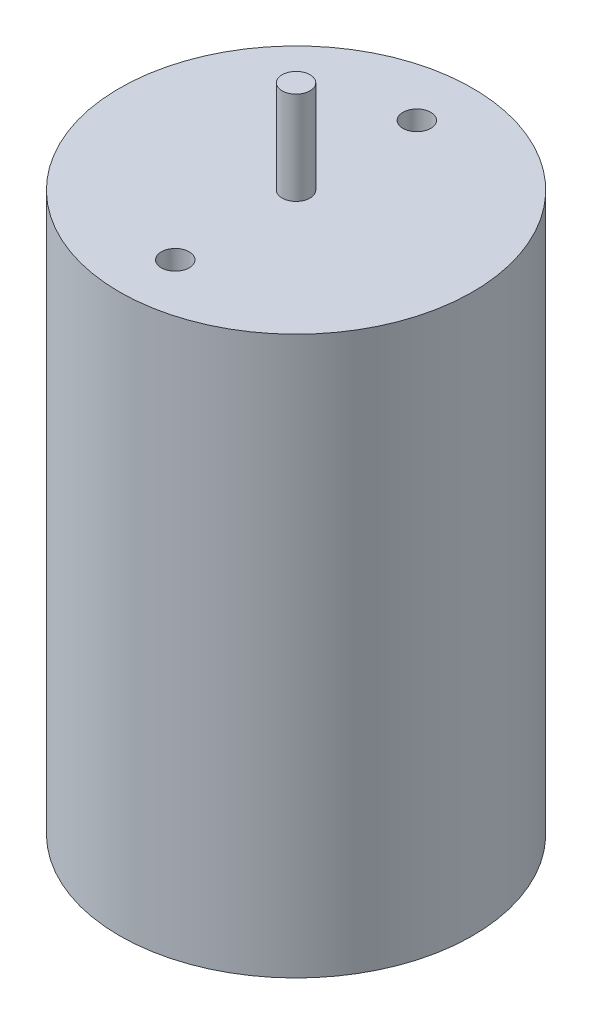
ISO-10303-21;
HEADER;
FILE_DESCRIPTION(('STEP AP214'),'2;1');
FILE_NAME('part.step','',(''),(''),'','','');
FILE_SCHEMA(('AUTOMOTIVE_DESIGN { 1 0 10303 214 1 1 1 1 }'));
ENDSEC;
DATA;
#1=APPLICATION_CONTEXT('core data for automotive mechanical design processes');
#2=APPLICATION_PROTOCOL_DEFINITION('international standard','automotive_design',2000,#1);
#3=PRODUCT_CONTEXT('',#1,'mechanical');
#4=PRODUCT('Part','Part','',(#3));
#5=PRODUCT_RELATED_PRODUCT_CATEGORY('part','',(#4));
#6=PRODUCT_DEFINITION_FORMATION('','',#4);
#7=PRODUCT_DEFINITION_CONTEXT('part definition',#1,'design');
#8=PRODUCT_DEFINITION('design','',#6,#7);
#9=PRODUCT_DEFINITION_SHAPE('','',#8);
#10=(LENGTH_UNIT() NAMED_UNIT(*) SI_UNIT(.MILLI.,.METRE.));
#11=(NAMED_UNIT(*) PLANE_ANGLE_UNIT() SI_UNIT($,.RADIAN.));
#12=(NAMED_UNIT(*) SI_UNIT($,.STERADIAN.) SOLID_ANGLE_UNIT());
#13=UNCERTAINTY_MEASURE_WITH_UNIT(LENGTH_MEASURE(1.E-05),#10,'distance_accuracy_value','');
#14=(GEOMETRIC_REPRESENTATION_CONTEXT(3) GLOBAL_UNCERTAINTY_ASSIGNED_CONTEXT((#13)) GLOBAL_UNIT_ASSIGNED_CONTEXT((#10,
#11,#12)) REPRESENTATION_CONTEXT('',''));
#15=CARTESIAN_POINT('',(0.,0.,0.));
#16=DIRECTION('',(0.,0.,1.));
#17=DIRECTION('',(1.,0.,0.));
#18=AXIS2_PLACEMENT_3D('',#15,#16,#17);
#19=CARTESIAN_POINT('',(0.,60.,0.));
#20=DIRECTION('',(0.,-1.,0.));
#21=DIRECTION('',(0.,0.,-1.));
#22=AXIS2_PLACEMENT_3D('',#19,#20,#21);
#23=CYLINDRICAL_SURFACE('',#22,19.);
#24=CARTESIAN_POINT('',(0.,60.,0.));
#25=DIRECTION('',(0.,1.,0.));
#26=DIRECTION('',(0.,0.,1.));
#27=AXIS2_PLACEMENT_3D('',#24,#25,#26);
#28=CIRCLE('',#27,19.);
#29=CARTESIAN_POINT('',(0.,60.,19.));
#30=VERTEX_POINT('',#29);
#31=EDGE_CURVE('E10',#30,#30,#28,.T.);
#32=ORIENTED_EDGE('',*,*,#31,.F.);
#33=EDGE_LOOP('',(#32));
#34=FACE_BOUND('',#33,.T.);
#35=CARTESIAN_POINT('',(0.,0.,0.));
#36=DIRECTION('',(0.,1.,0.));
#37=DIRECTION('',(0.,0.,1.));
#38=AXIS2_PLACEMENT_3D('',#35,#36,#37);
#39=CIRCLE('',#38,19.);
#40=CARTESIAN_POINT('',(0.,0.,19.));
#41=VERTEX_POINT('',#40);
#42=EDGE_CURVE('E36',#41,#41,#39,.T.);
#43=ORIENTED_EDGE('',*,*,#42,.T.);
#44=EDGE_LOOP('',(#43));
#45=FACE_BOUND('',#44,.T.);
#46=ADVANCED_FACE('F33',(#34,#45),#23,.T.);
#47=CARTESIAN_POINT('',(0.,60.,0.));
#48=DIRECTION('',(0.,1.,0.));
#49=DIRECTION('',(0.,0.,1.));
#50=AXIS2_PLACEMENT_3D('',#47,#48,#49);
#51=PLANE('',#50);
#52=CARTESIAN_POINT('',(0.,60.,13.));
#53=DIRECTION('',(0.,1.,0.));
#54=DIRECTION('',(0.,0.,1.));
#55=AXIS2_PLACEMENT_3D('',#52,#53,#54);
#56=CIRCLE('',#55,1.5);
#57=CARTESIAN_POINT('',(0.,60.,14.5));
#58=VERTEX_POINT('',#57);
#59=EDGE_CURVE('E57',#58,#58,#56,.T.);
#60=ORIENTED_EDGE('',*,*,#59,.F.);
#61=EDGE_LOOP('',(#60));
#62=FACE_BOUND('',#61,.T.);
#63=CARTESIAN_POINT('',(0.,60.,-13.));
#64=DIRECTION('',(0.,1.,0.));
#65=DIRECTION('',(0.,0.,1.));
#66=AXIS2_PLACEMENT_3D('',#63,#64,#65);
#67=CIRCLE('',#66,1.5);
#68=CARTESIAN_POINT('',(0.,60.,-11.5));
#69=VERTEX_POINT('',#68);
#70=EDGE_CURVE('E51',#69,#69,#67,.T.);
#71=ORIENTED_EDGE('',*,*,#70,.F.);
#72=EDGE_LOOP('',(#71));
#73=FACE_BOUND('',#72,.T.);
#74=CARTESIAN_POINT('',(0.,60.,0.));
#75=DIRECTION('',(0.,1.,0.));
#76=DIRECTION('',(0.,0.,1.));
#77=AXIS2_PLACEMENT_3D('',#74,#75,#76);
#78=CIRCLE('',#77,1.5);
#79=CARTESIAN_POINT('',(0.,60.,1.5));
#80=VERTEX_POINT('',#79);
#81=EDGE_CURVE('E45',#80,#80,#78,.T.);
#82=ORIENTED_EDGE('',*,*,#81,.F.);
#83=EDGE_LOOP('',(#82));
#84=FACE_BOUND('',#83,.T.);
#85=ORIENTED_EDGE('',*,*,#31,.T.);
#86=EDGE_LOOP('',(#85));
#87=FACE_BOUND('',#86,.T.);
#88=ADVANCED_FACE('F72',(#62,#73,#84,#87),#51,.T.);
#89=CARTESIAN_POINT('',(0.,0.,0.));
#90=DIRECTION('',(0.,1.,0.));
#91=DIRECTION('',(0.,0.,1.));
#92=AXIS2_PLACEMENT_3D('',#89,#90,#91);
#93=PLANE('',#92);
#94=ORIENTED_EDGE('',*,*,#42,.F.);
#95=EDGE_LOOP('',(#94));
#96=FACE_BOUND('',#95,.T.);
#97=ADVANCED_FACE('F75',(#96),#93,.F.);
#98=CARTESIAN_POINT('',(0.,70.,0.));
#99=DIRECTION('',(0.,-1.,0.));
#100=DIRECTION('',(0.,0.,-1.));
#101=AXIS2_PLACEMENT_3D('',#98,#99,#100);
#102=CYLINDRICAL_SURFACE('',#101,1.5);
#103=CARTESIAN_POINT('',(0.,70.,0.));
#104=DIRECTION('',(0.,1.,0.));
#105=DIRECTION('',(0.,0.,1.));
#106=AXIS2_PLACEMENT_3D('',#103,#104,#105);
#107=CIRCLE('',#106,1.5);
#108=CARTESIAN_POINT('',(0.,70.,1.5));
#109=VERTEX_POINT('',#108);
#110=EDGE_CURVE('E43',#109,#109,#107,.T.);
#111=ORIENTED_EDGE('',*,*,#110,.F.);
#112=EDGE_LOOP('',(#111));
#113=FACE_BOUND('',#112,.T.);
#114=ORIENTED_EDGE('',*,*,#81,.T.);
#115=EDGE_LOOP('',(#114));
#116=FACE_BOUND('',#115,.T.);
#117=ADVANCED_FACE('F81',(#113,#116),#102,.T.);
#118=CARTESIAN_POINT('',(0.,70.,0.));
#119=DIRECTION('',(0.,1.,0.));
#120=DIRECTION('',(0.,0.,1.));
#121=AXIS2_PLACEMENT_3D('',#118,#119,#120);
#122=PLANE('',#121);
#123=ORIENTED_EDGE('',*,*,#110,.T.);
#124=EDGE_LOOP('',(#123));
#125=FACE_BOUND('',#124,.T.);
#126=ADVANCED_FACE('F83',(#125),#122,.T.);
#127=CARTESIAN_POINT('',(0.,50.,-13.));
#128=DIRECTION('',(0.,1.,0.));
#129=DIRECTION('',(0.,0.,1.));
#130=AXIS2_PLACEMENT_3D('',#127,#128,#129);
#131=CYLINDRICAL_SURFACE('',#130,1.5);
#132=CARTESIAN_POINT('',(0.,50.,-13.));
#133=DIRECTION('',(0.,1.,0.));
#134=DIRECTION('',(0.,0.,1.));
#135=AXIS2_PLACEMENT_3D('',#132,#133,#134);
#136=CIRCLE('',#135,1.5);
#137=CARTESIAN_POINT('',(0.,50.,-11.5));
#138=VERTEX_POINT('',#137);
#139=EDGE_CURVE('E54',#138,#138,#136,.T.);
#140=ORIENTED_EDGE('',*,*,#139,.F.);
#141=EDGE_LOOP('',(#140));
#142=FACE_BOUND('',#141,.T.);
#143=ORIENTED_EDGE('',*,*,#70,.T.);
#144=EDGE_LOOP('',(#143));
#145=FACE_BOUND('',#144,.T.);
#146=ADVANCED_FACE('F90',(#142,#145),#131,.F.);
#147=CARTESIAN_POINT('',(0.,50.,-13.));
#148=DIRECTION('',(0.,1.,0.));
#149=DIRECTION('',(0.,0.,1.));
#150=AXIS2_PLACEMENT_3D('',#147,#148,#149);
#151=PLANE('',#150);
#152=ORIENTED_EDGE('',*,*,#139,.T.);
#153=EDGE_LOOP('',(#152));
#154=FACE_BOUND('',#153,.T.);
#155=ADVANCED_FACE('F68',(#154),#151,.T.);
#156=CARTESIAN_POINT('',(0.,50.,13.));
#157=DIRECTION('',(0.,1.,0.));
#158=DIRECTION('',(0.,0.,1.));
#159=AXIS2_PLACEMENT_3D('',#156,#157,#158);
#160=CYLINDRICAL_SURFACE('',#159,1.5);
#161=CARTESIAN_POINT('',(0.,50.,13.));
#162=DIRECTION('',(0.,1.,0.));
#163=DIRECTION('',(0.,0.,1.));
#164=AXIS2_PLACEMENT_3D('',#161,#162,#163);
#165=CIRCLE('',#164,1.5);
#166=CARTESIAN_POINT('',(0.,50.,14.5));
#167=VERTEX_POINT('',#166);
#168=EDGE_CURVE('E48',#167,#167,#165,.T.);
#169=ORIENTED_EDGE('',*,*,#168,.F.);
#170=EDGE_LOOP('',(#169));
#171=FACE_BOUND('',#170,.T.);
#172=ORIENTED_EDGE('',*,*,#59,.T.);
#173=EDGE_LOOP('',(#172));
#174=FACE_BOUND('',#173,.T.);
#175=ADVANCED_FACE('F65',(#171,#174),#160,.F.);
#176=CARTESIAN_POINT('',(0.,50.,13.));
#177=DIRECTION('',(0.,1.,0.));
#178=DIRECTION('',(0.,0.,1.));
#179=AXIS2_PLACEMENT_3D('',#176,#177,#178);
#180=PLANE('',#179);
#181=ORIENTED_EDGE('',*,*,#168,.T.);
#182=EDGE_LOOP('',(#181));
#183=FACE_BOUND('',#182,.T.);
#184=ADVANCED_FACE('F63',(#183),#180,.T.);
#185=CLOSED_SHELL('',(#46,#88,#97,#117,#126,#146,#155,#175,#184));
#186=MANIFOLD_SOLID_BREP('B2',#185);
#187=ADVANCED_BREP_SHAPE_REPRESENTATION('',(#18,#186),#14);
#188=SHAPE_DEFINITION_REPRESENTATION(#9,#187);
ENDSEC;
END-ISO-10303-21;
